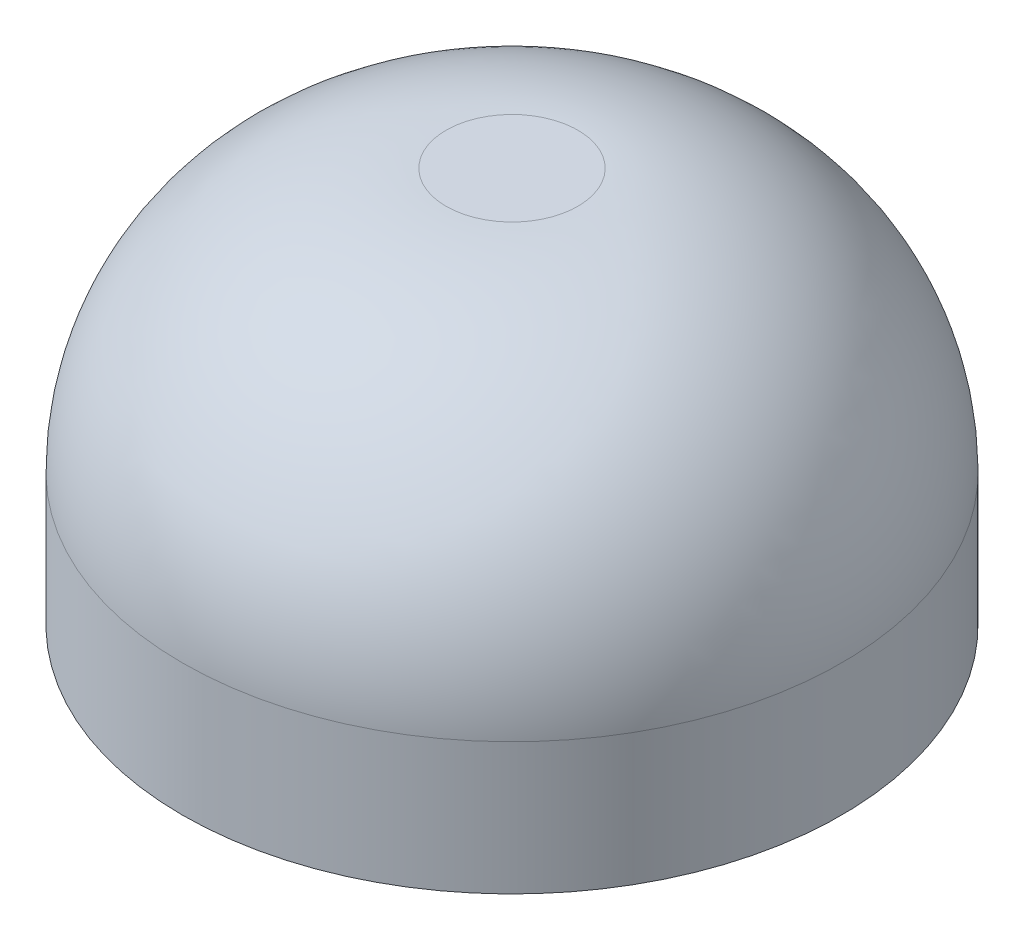
ISO-10303-21;
HEADER;
FILE_DESCRIPTION(('STEP AP214'),'2;1');
FILE_NAME('part.step','',(''),(''),'','','');
FILE_SCHEMA(('AUTOMOTIVE_DESIGN { 1 0 10303 214 1 1 1 1 }'));
ENDSEC;
DATA;
#1=APPLICATION_CONTEXT('core data for automotive mechanical design processes');
#2=APPLICATION_PROTOCOL_DEFINITION('international standard','automotive_design',2000,#1);
#3=PRODUCT_CONTEXT('',#1,'mechanical');
#4=PRODUCT('Part','Part','',(#3));
#5=PRODUCT_RELATED_PRODUCT_CATEGORY('part','',(#4));
#6=PRODUCT_DEFINITION_FORMATION('','',#4);
#7=PRODUCT_DEFINITION_CONTEXT('part definition',#1,'design');
#8=PRODUCT_DEFINITION('design','',#6,#7);
#9=PRODUCT_DEFINITION_SHAPE('','',#8);
#10=(LENGTH_UNIT() NAMED_UNIT(*) SI_UNIT(.MILLI.,.METRE.));
#11=(NAMED_UNIT(*) PLANE_ANGLE_UNIT() SI_UNIT($,.RADIAN.));
#12=(NAMED_UNIT(*) SI_UNIT($,.STERADIAN.) SOLID_ANGLE_UNIT());
#13=UNCERTAINTY_MEASURE_WITH_UNIT(LENGTH_MEASURE(1.E-05),#10,'distance_accuracy_value','');
#14=(GEOMETRIC_REPRESENTATION_CONTEXT(3) GLOBAL_UNCERTAINTY_ASSIGNED_CONTEXT((#13)) GLOBAL_UNIT_ASSIGNED_CONTEXT((#10,
#11,#12)) REPRESENTATION_CONTEXT('',''));
#15=CARTESIAN_POINT('',(0.,0.,0.));
#16=DIRECTION('',(0.,0.,1.));
#17=DIRECTION('',(1.,0.,0.));
#18=AXIS2_PLACEMENT_3D('',#15,#16,#17);
#19=CARTESIAN_POINT('',(0.,3.,0.));
#20=DIRECTION('',(0.,-1.,0.));
#21=DIRECTION('',(0.,0.,-1.));
#22=AXIS2_PLACEMENT_3D('',#19,#20,#21);
#23=CYLINDRICAL_SURFACE('',#22,2.5);
#24=CARTESIAN_POINT('',(0.,1.,0.));
#25=DIRECTION('',(0.,1.,0.));
#26=DIRECTION('',(0.,0.,1.));
#27=AXIS2_PLACEMENT_3D('',#24,#25,#26);
#28=CIRCLE('',#27,2.5);
#29=CARTESIAN_POINT('',(0.,1.,2.5));
#30=VERTEX_POINT('',#29);
#31=EDGE_CURVE('E10',#30,#30,#28,.F.);
#32=ORIENTED_EDGE('',*,*,#31,.T.);
#33=EDGE_LOOP('',(#32));
#34=FACE_BOUND('',#33,.T.);
#35=CARTESIAN_POINT('',(0.,0.,0.));
#36=DIRECTION('',(0.,1.,0.));
#37=DIRECTION('',(0.,0.,1.));
#38=AXIS2_PLACEMENT_3D('',#35,#36,#37);
#39=CIRCLE('',#38,2.5);
#40=CARTESIAN_POINT('',(0.,0.,2.5));
#41=VERTEX_POINT('',#40);
#42=EDGE_CURVE('E42',#41,#41,#39,.T.);
#43=ORIENTED_EDGE('',*,*,#42,.T.);
#44=EDGE_LOOP('',(#43));
#45=FACE_BOUND('',#44,.T.);
#46=ADVANCED_FACE('F31',(#34,#45),#23,.T.);
#47=CARTESIAN_POINT('',(0.,3.,0.));
#48=DIRECTION('',(0.,1.,0.));
#49=DIRECTION('',(0.,0.,1.));
#50=AXIS2_PLACEMENT_3D('',#47,#48,#49);
#51=PLANE('',#50);
#52=CARTESIAN_POINT('',(0.,3.,0.));
#53=DIRECTION('',(0.,1.,0.));
#54=DIRECTION('',(0.,0.,1.));
#55=AXIS2_PLACEMENT_3D('',#52,#53,#54);
#56=CIRCLE('',#55,0.5);
#57=CARTESIAN_POINT('',(0.,3.,0.5));
#58=VERTEX_POINT('',#57);
#59=EDGE_CURVE('E38',#58,#58,#56,.T.);
#60=ORIENTED_EDGE('',*,*,#59,.T.);
#61=EDGE_LOOP('',(#60));
#62=FACE_BOUND('',#61,.T.);
#63=ADVANCED_FACE('F69',(#62),#51,.T.);
#64=CARTESIAN_POINT('',(0.,0.,0.));
#65=DIRECTION('',(0.,1.,0.));
#66=DIRECTION('',(0.,0.,1.));
#67=AXIS2_PLACEMENT_3D('',#64,#65,#66);
#68=PLANE('',#67);
#69=CARTESIAN_POINT('',(0.,0.,0.));
#70=DIRECTION('',(0.,1.,0.));
#71=DIRECTION('',(0.,0.,1.));
#72=AXIS2_PLACEMENT_3D('',#69,#70,#71);
#73=CIRCLE('',#72,0.500000000000001);
#74=CARTESIAN_POINT('',(0.,0.,0.500000000000001));
#75=VERTEX_POINT('',#74);
#76=EDGE_CURVE('E49',#75,#75,#73,.T.);
#77=ORIENTED_EDGE('',*,*,#76,.T.);
#78=EDGE_LOOP('',(#77));
#79=FACE_BOUND('',#78,.T.);
#80=ORIENTED_EDGE('',*,*,#42,.F.);
#81=EDGE_LOOP('',(#80));
#82=FACE_BOUND('',#81,.T.);
#83=ADVANCED_FACE('F66',(#79,#82),#68,.F.);
#84=CARTESIAN_POINT('',(0.,1.5,0.));
#85=DIRECTION('',(0.,-1.,0.));
#86=DIRECTION('',(0.,0.,-1.));
#87=AXIS2_PLACEMENT_3D('',#84,#85,#86);
#88=CYLINDRICAL_SURFACE('',#87,0.500000000000001);
#89=CARTESIAN_POINT('',(0.,1.5,0.));
#90=DIRECTION('',(0.,1.,0.));
#91=DIRECTION('',(0.,0.,1.));
#92=AXIS2_PLACEMENT_3D('',#89,#90,#91);
#93=CIRCLE('',#92,0.500000000000001);
#94=CARTESIAN_POINT('',(0.,1.5,0.500000000000001));
#95=VERTEX_POINT('',#94);
#96=EDGE_CURVE('E46',#95,#95,#93,.T.);
#97=ORIENTED_EDGE('',*,*,#96,.T.);
#98=EDGE_LOOP('',(#97));
#99=FACE_BOUND('',#98,.T.);
#100=ORIENTED_EDGE('',*,*,#76,.F.);
#101=EDGE_LOOP('',(#100));
#102=FACE_BOUND('',#101,.T.);
#103=ADVANCED_FACE('F55',(#99,#102),#88,.F.);
#104=CARTESIAN_POINT('',(0.,1.5,0.));
#105=DIRECTION('',(0.,1.,0.));
#106=DIRECTION('',(0.,0.,1.));
#107=AXIS2_PLACEMENT_3D('',#104,#105,#106);
#108=PLANE('',#107);
#109=ORIENTED_EDGE('',*,*,#96,.F.);
#110=EDGE_LOOP('',(#109));
#111=FACE_BOUND('',#110,.T.);
#112=ADVANCED_FACE('F58',(#111),#108,.F.);
#113=CARTESIAN_POINT('',(0.,1.,0.));
#114=DIRECTION('',(0.,1.,0.));
#115=DIRECTION('',(0.,0.,1.));
#116=AXIS2_PLACEMENT_3D('',#113,#114,#115);
#117=DEGENERATE_TOROIDAL_SURFACE('',#116,0.5,2.,.T.);
#118=ORIENTED_EDGE('',*,*,#31,.F.);
#119=EDGE_LOOP('',(#118));
#120=FACE_BOUND('',#119,.T.);
#121=ORIENTED_EDGE('',*,*,#59,.F.);
#122=EDGE_LOOP('',(#121));
#123=FACE_BOUND('',#122,.T.);
#124=ADVANCED_FACE('F33',(#120,#123),#117,.T.);
#125=CLOSED_SHELL('',(#46,#63,#83,#103,#112,#124));
#126=MANIFOLD_SOLID_BREP('B2',#125);
#127=ADVANCED_BREP_SHAPE_REPRESENTATION('',(#18,#126),#14);
#128=SHAPE_DEFINITION_REPRESENTATION(#9,#127);
ENDSEC;
END-ISO-10303-21;
